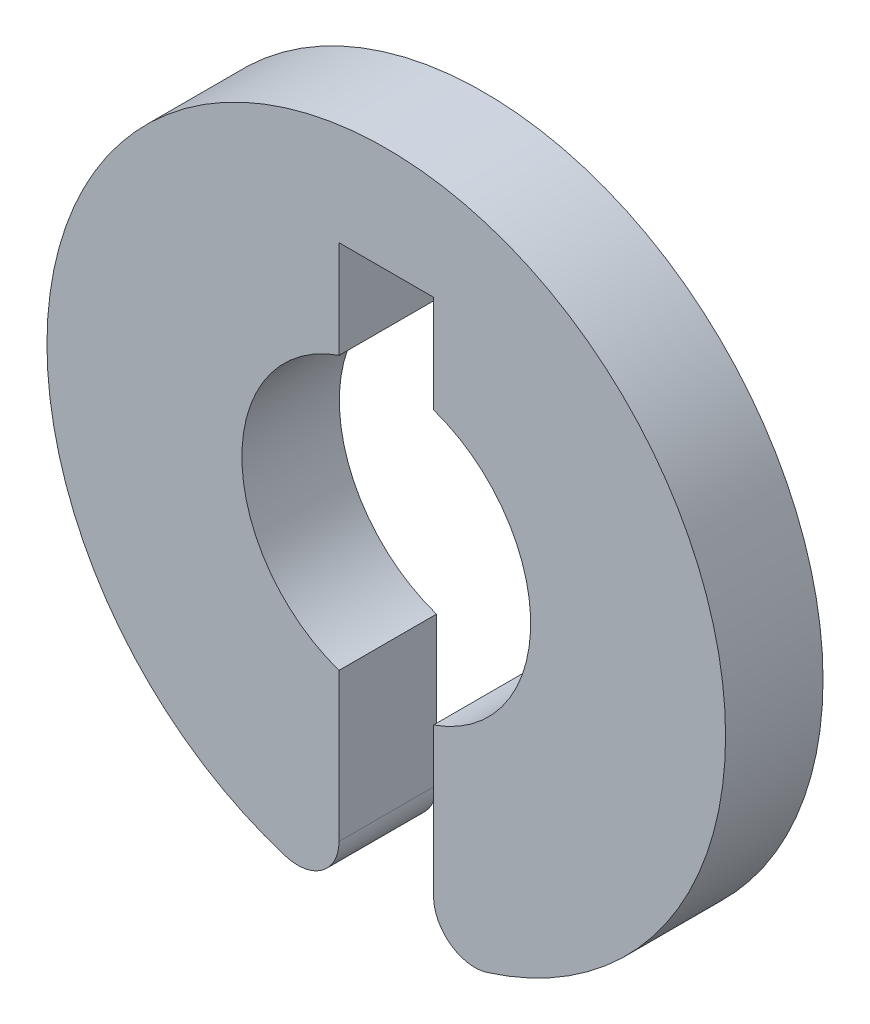
ISO-10303-21;
HEADER;
FILE_DESCRIPTION(('STEP AP214'),'2;1');
FILE_NAME('part.step','',(''),(''),'','','');
FILE_SCHEMA(('AUTOMOTIVE_DESIGN { 1 0 10303 214 1 1 1 1 }'));
ENDSEC;
DATA;
#1=APPLICATION_CONTEXT('core data for automotive mechanical design processes');
#2=APPLICATION_PROTOCOL_DEFINITION('international standard','automotive_design',2000,#1);
#3=PRODUCT_CONTEXT('',#1,'mechanical');
#4=PRODUCT('Part','Part','',(#3));
#5=PRODUCT_RELATED_PRODUCT_CATEGORY('part','',(#4));
#6=PRODUCT_DEFINITION_FORMATION('','',#4);
#7=PRODUCT_DEFINITION_CONTEXT('part definition',#1,'design');
#8=PRODUCT_DEFINITION('design','',#6,#7);
#9=PRODUCT_DEFINITION_SHAPE('','',#8);
#10=(LENGTH_UNIT() NAMED_UNIT(*) SI_UNIT(.MILLI.,.METRE.));
#11=(NAMED_UNIT(*) PLANE_ANGLE_UNIT() SI_UNIT($,.RADIAN.));
#12=(NAMED_UNIT(*) SI_UNIT($,.STERADIAN.) SOLID_ANGLE_UNIT());
#13=UNCERTAINTY_MEASURE_WITH_UNIT(LENGTH_MEASURE(1.E-05),#10,'distance_accuracy_value','');
#14=(GEOMETRIC_REPRESENTATION_CONTEXT(3) GLOBAL_UNCERTAINTY_ASSIGNED_CONTEXT((#13)) GLOBAL_UNIT_ASSIGNED_CONTEXT((#10,
#11,#12)) REPRESENTATION_CONTEXT('',''));
#15=CARTESIAN_POINT('',(0.,0.,0.));
#16=DIRECTION('',(0.,0.,1.));
#17=DIRECTION('',(1.,0.,0.));
#18=AXIS2_PLACEMENT_3D('',#15,#16,#17);
#19=CARTESIAN_POINT('',(0.,0.,3.));
#20=DIRECTION('',(0.,0.,-1.));
#21=DIRECTION('',(-1.,0.,0.));
#22=AXIS2_PLACEMENT_3D('',#19,#20,#21);
#23=CYLINDRICAL_SURFACE('',#22,4.445);
#24=CARTESIAN_POINT('',(0.,0.,0.));
#25=DIRECTION('',(0.,0.,-1.));
#26=DIRECTION('',(1.,0.,0.));
#27=AXIS2_PLACEMENT_3D('',#24,#25,#26);
#28=CIRCLE('',#27,4.445);
#29=CARTESIAN_POINT('',(1.4475,4.20270969137769,0.));
#30=VERTEX_POINT('',#29);
#31=CARTESIAN_POINT('',(1.455,-4.20011904593191,0.));
#32=VERTEX_POINT('',#31);
#33=EDGE_CURVE('E137',#30,#32,#28,.T.);
#34=ORIENTED_EDGE('',*,*,#33,.T.);
#35=DIRECTION('',(0.,0.,-1.));
#36=VECTOR('',#35,1.);
#37=CARTESIAN_POINT('',(1.455,-4.20011904593191,3.));
#38=LINE('',#37,#36);
#39=CARTESIAN_POINT('',(1.455,-4.20011904593191,3.));
#40=VERTEX_POINT('',#39);
#41=EDGE_CURVE('E125',#40,#32,#38,.T.);
#42=ORIENTED_EDGE('',*,*,#41,.F.);
#43=CARTESIAN_POINT('',(0.,0.,3.));
#44=DIRECTION('',(0.,0.,-1.));
#45=DIRECTION('',(1.,0.,0.));
#46=AXIS2_PLACEMENT_3D('',#43,#44,#45);
#47=CIRCLE('',#46,4.445);
#48=CARTESIAN_POINT('',(1.4475,4.20270969137769,3.));
#49=VERTEX_POINT('',#48);
#50=EDGE_CURVE('E130',#49,#40,#47,.T.);
#51=ORIENTED_EDGE('',*,*,#50,.F.);
#52=DIRECTION('',(0.,0.,-1.));
#53=VECTOR('',#52,1.);
#54=CARTESIAN_POINT('',(1.4475,4.20270969137769,3.));
#55=LINE('',#54,#53);
#56=EDGE_CURVE('E183',#49,#30,#55,.T.);
#57=ORIENTED_EDGE('',*,*,#56,.T.);
#58=EDGE_LOOP('',(#34,#42,#51,#57));
#59=FACE_BOUND('',#58,.T.);
#60=ADVANCED_FACE('F45',(#59),#23,.F.);
#61=CARTESIAN_POINT('',(1.455,-10.3431619923503,3.));
#62=DIRECTION('',(1.,0.,0.));
#63=DIRECTION('',(0.,0.,-1.));
#64=AXIS2_PLACEMENT_3D('',#61,#62,#63);
#65=PLANE('',#64);
#66=DIRECTION('',(0.,-1.,0.));
#67=VECTOR('',#66,1.);
#68=CARTESIAN_POINT('',(1.455,-10.3431619923503,0.));
#69=LINE('',#68,#67);
#70=CARTESIAN_POINT('',(1.455,-8.76099309439289,0.));
#71=VERTEX_POINT('',#70);
#72=EDGE_CURVE('E187',#32,#71,#69,.T.);
#73=ORIENTED_EDGE('',*,*,#72,.T.);
#74=DIRECTION('',(0.,0.,-1.));
#75=VECTOR('',#74,1.);
#76=CARTESIAN_POINT('',(1.455,-8.76099309439289,3.));
#77=LINE('',#76,#75);
#78=CARTESIAN_POINT('',(1.455,-8.76099309439289,3.));
#79=VERTEX_POINT('',#78);
#80=EDGE_CURVE('E12',#71,#79,#77,.F.);
#81=ORIENTED_EDGE('',*,*,#80,.T.);
#82=DIRECTION('',(0.,-1.,0.));
#83=VECTOR('',#82,1.);
#84=CARTESIAN_POINT('',(1.455,-10.3431619923503,3.));
#85=LINE('',#84,#83);
#86=EDGE_CURVE('E119',#40,#79,#85,.T.);
#87=ORIENTED_EDGE('',*,*,#86,.F.);
#88=ORIENTED_EDGE('',*,*,#41,.T.);
#89=EDGE_LOOP('',(#73,#81,#87,#88));
#90=FACE_BOUND('',#89,.T.);
#91=ADVANCED_FACE('F120',(#90),#65,.F.);
#92=CARTESIAN_POINT('',(0.,0.,3.));
#93=DIRECTION('',(0.,0.,-1.));
#94=DIRECTION('',(-1.,0.,0.));
#95=AXIS2_PLACEMENT_3D('',#92,#93,#94);
#96=CYLINDRICAL_SURFACE('',#95,10.445);
#97=CARTESIAN_POINT('',(0.,0.,0.));
#98=DIRECTION('',(0.,0.,1.));
#99=DIRECTION('',(-1.,0.,0.));
#100=AXIS2_PLACEMENT_3D('',#97,#98,#99);
#101=CIRCLE('',#100,10.445);
#102=CARTESIAN_POINT('',(3.10219346049046,-9.97368641645055,0.));
#103=VERTEX_POINT('',#102);
#104=CARTESIAN_POINT('',(-3.10219346049046,-9.97368641645055,0.));
#105=VERTEX_POINT('',#104);
#106=EDGE_CURVE('E188',#103,#105,#101,.T.);
#107=ORIENTED_EDGE('',*,*,#106,.T.);
#108=DIRECTION('',(0.,0.,-1.));
#109=VECTOR('',#108,1.);
#110=CARTESIAN_POINT('',(-3.10219346049046,-9.97368641645055,3.));
#111=LINE('',#110,#109);
#112=CARTESIAN_POINT('',(-3.10219346049046,-9.97368641645055,3.));
#113=VERTEX_POINT('',#112);
#114=EDGE_CURVE('E64',#105,#113,#111,.F.);
#115=ORIENTED_EDGE('',*,*,#114,.T.);
#116=CARTESIAN_POINT('',(0.,0.,3.));
#117=DIRECTION('',(0.,0.,1.));
#118=DIRECTION('',(-1.,0.,0.));
#119=AXIS2_PLACEMENT_3D('',#116,#117,#118);
#120=CIRCLE('',#119,10.445);
#121=CARTESIAN_POINT('',(3.10219346049046,-9.97368641645055,3.));
#122=VERTEX_POINT('',#121);
#123=EDGE_CURVE('E127',#122,#113,#120,.T.);
#124=ORIENTED_EDGE('',*,*,#123,.F.);
#125=DIRECTION('',(0.,0.,-1.));
#126=VECTOR('',#125,1.);
#127=CARTESIAN_POINT('',(3.10219346049046,-9.97368641645055,3.));
#128=LINE('',#127,#126);
#129=EDGE_CURVE('E152',#122,#103,#128,.T.);
#130=ORIENTED_EDGE('',*,*,#129,.T.);
#131=EDGE_LOOP('',(#107,#115,#124,#130));
#132=FACE_BOUND('',#131,.T.);
#133=ADVANCED_FACE('F231',(#132),#96,.T.);
#134=CARTESIAN_POINT('',(-1.455,-10.3431619923503,3.));
#135=DIRECTION('',(-1.,0.,0.));
#136=DIRECTION('',(0.,0.,1.));
#137=AXIS2_PLACEMENT_3D('',#134,#135,#136);
#138=PLANE('',#137);
#139=DIRECTION('',(0.,1.,0.));
#140=VECTOR('',#139,1.);
#141=CARTESIAN_POINT('',(-1.455,-10.3431619923503,3.));
#142=LINE('',#141,#140);
#143=CARTESIAN_POINT('',(-1.455,-8.76099309439289,3.));
#144=VERTEX_POINT('',#143);
#145=CARTESIAN_POINT('',(-1.455,-4.20011904593191,3.));
#146=VERTEX_POINT('',#145);
#147=EDGE_CURVE('E169',#144,#146,#142,.T.);
#148=ORIENTED_EDGE('',*,*,#147,.F.);
#149=DIRECTION('',(0.,0.,-1.));
#150=VECTOR('',#149,1.);
#151=CARTESIAN_POINT('',(-1.455,-8.76099309439289,3.));
#152=LINE('',#151,#150);
#153=CARTESIAN_POINT('',(-1.455,-8.76099309439289,0.));
#154=VERTEX_POINT('',#153);
#155=EDGE_CURVE('E139',#144,#154,#152,.T.);
#156=ORIENTED_EDGE('',*,*,#155,.T.);
#157=DIRECTION('',(0.,1.,0.));
#158=VECTOR('',#157,1.);
#159=CARTESIAN_POINT('',(-1.455,-10.3431619923503,0.));
#160=LINE('',#159,#158);
#161=CARTESIAN_POINT('',(-1.455,-4.20011904593191,0.));
#162=VERTEX_POINT('',#161);
#163=EDGE_CURVE('E191',#154,#162,#160,.T.);
#164=ORIENTED_EDGE('',*,*,#163,.T.);
#165=DIRECTION('',(0.,0.,-1.));
#166=VECTOR('',#165,1.);
#167=CARTESIAN_POINT('',(-1.455,-4.20011904593191,3.));
#168=LINE('',#167,#166);
#169=EDGE_CURVE('E143',#146,#162,#168,.T.);
#170=ORIENTED_EDGE('',*,*,#169,.F.);
#171=EDGE_LOOP('',(#148,#156,#164,#170));
#172=FACE_BOUND('',#171,.T.);
#173=ADVANCED_FACE('F240',(#172),#138,.F.);
#174=CARTESIAN_POINT('',(0.,0.,3.));
#175=DIRECTION('',(0.,0.,-1.));
#176=DIRECTION('',(-1.,0.,0.));
#177=AXIS2_PLACEMENT_3D('',#174,#175,#176);
#178=CYLINDRICAL_SURFACE('',#177,4.445);
#179=CARTESIAN_POINT('',(0.,0.,0.));
#180=DIRECTION('',(0.,0.,-1.));
#181=DIRECTION('',(1.,0.,0.));
#182=AXIS2_PLACEMENT_3D('',#179,#180,#181);
#183=CIRCLE('',#182,4.445);
#184=CARTESIAN_POINT('',(-1.4475,4.20270969137769,0.));
#185=VERTEX_POINT('',#184);
#186=EDGE_CURVE('E193',#162,#185,#183,.T.);
#187=ORIENTED_EDGE('',*,*,#186,.T.);
#188=DIRECTION('',(0.,0.,-1.));
#189=VECTOR('',#188,1.);
#190=CARTESIAN_POINT('',(-1.4475,4.20270969137769,3.));
#191=LINE('',#190,#189);
#192=CARTESIAN_POINT('',(-1.4475,4.20270969137769,3.));
#193=VERTEX_POINT('',#192);
#194=EDGE_CURVE('E150',#193,#185,#191,.T.);
#195=ORIENTED_EDGE('',*,*,#194,.F.);
#196=CARTESIAN_POINT('',(0.,0.,3.));
#197=DIRECTION('',(0.,0.,-1.));
#198=DIRECTION('',(1.,0.,0.));
#199=AXIS2_PLACEMENT_3D('',#196,#197,#198);
#200=CIRCLE('',#199,4.445);
#201=EDGE_CURVE('E168',#146,#193,#200,.T.);
#202=ORIENTED_EDGE('',*,*,#201,.F.);
#203=ORIENTED_EDGE('',*,*,#169,.T.);
#204=EDGE_LOOP('',(#187,#195,#202,#203));
#205=FACE_BOUND('',#204,.T.);
#206=ADVANCED_FACE('F239',(#205),#178,.F.);
#207=CARTESIAN_POINT('',(-1.4475,7.20270969137769,3.));
#208=DIRECTION('',(-1.,0.,0.));
#209=DIRECTION('',(0.,-1.,0.));
#210=AXIS2_PLACEMENT_3D('',#207,#208,#209);
#211=PLANE('',#210);
#212=DIRECTION('',(0.,1.,0.));
#213=VECTOR('',#212,1.);
#214=CARTESIAN_POINT('',(-1.4475,7.20270969137769,0.));
#215=LINE('',#214,#213);
#216=CARTESIAN_POINT('',(-1.4475,7.20270969137769,0.));
#217=VERTEX_POINT('',#216);
#218=EDGE_CURVE('E194',#185,#217,#215,.T.);
#219=ORIENTED_EDGE('',*,*,#218,.T.);
#220=DIRECTION('',(0.,0.,-1.));
#221=VECTOR('',#220,1.);
#222=CARTESIAN_POINT('',(-1.4475,7.20270969137769,3.));
#223=LINE('',#222,#221);
#224=CARTESIAN_POINT('',(-1.4475,7.20270969137769,3.));
#225=VERTEX_POINT('',#224);
#226=EDGE_CURVE('E204',#225,#217,#223,.T.);
#227=ORIENTED_EDGE('',*,*,#226,.F.);
#228=DIRECTION('',(0.,1.,0.));
#229=VECTOR('',#228,1.);
#230=CARTESIAN_POINT('',(-1.4475,7.20270969137769,3.));
#231=LINE('',#230,#229);
#232=EDGE_CURVE('E173',#193,#225,#231,.T.);
#233=ORIENTED_EDGE('',*,*,#232,.F.);
#234=ORIENTED_EDGE('',*,*,#194,.T.);
#235=EDGE_LOOP('',(#219,#227,#233,#234));
#236=FACE_BOUND('',#235,.T.);
#237=ADVANCED_FACE('F211',(#236),#211,.F.);
#238=CARTESIAN_POINT('',(-1.4475,7.20270969137769,3.));
#239=DIRECTION('',(0.,1.,0.));
#240=DIRECTION('',(0.,0.,1.));
#241=AXIS2_PLACEMENT_3D('',#238,#239,#240);
#242=PLANE('',#241);
#243=DIRECTION('',(1.,0.,0.));
#244=VECTOR('',#243,1.);
#245=CARTESIAN_POINT('',(-1.4475,7.20270969137769,0.));
#246=LINE('',#245,#244);
#247=CARTESIAN_POINT('',(1.4475,7.20270969137769,0.));
#248=VERTEX_POINT('',#247);
#249=EDGE_CURVE('E197',#217,#248,#246,.T.);
#250=ORIENTED_EDGE('',*,*,#249,.T.);
#251=DIRECTION('',(0.,0.,-1.));
#252=VECTOR('',#251,1.);
#253=CARTESIAN_POINT('',(1.4475,7.20270969137769,3.));
#254=LINE('',#253,#252);
#255=CARTESIAN_POINT('',(1.4475,7.20270969137769,3.));
#256=VERTEX_POINT('',#255);
#257=EDGE_CURVE('E203',#256,#248,#254,.T.);
#258=ORIENTED_EDGE('',*,*,#257,.F.);
#259=DIRECTION('',(1.,0.,0.));
#260=VECTOR('',#259,1.);
#261=CARTESIAN_POINT('',(-1.4475,7.20270969137769,3.));
#262=LINE('',#261,#260);
#263=EDGE_CURVE('E180',#225,#256,#262,.T.);
#264=ORIENTED_EDGE('',*,*,#263,.F.);
#265=ORIENTED_EDGE('',*,*,#226,.T.);
#266=EDGE_LOOP('',(#250,#258,#264,#265));
#267=FACE_BOUND('',#266,.T.);
#268=ADVANCED_FACE('F224',(#267),#242,.F.);
#269=CARTESIAN_POINT('',(1.4475,7.20270969137769,3.));
#270=DIRECTION('',(1.,0.,0.));
#271=DIRECTION('',(0.,1.,0.));
#272=AXIS2_PLACEMENT_3D('',#269,#270,#271);
#273=PLANE('',#272);
#274=DIRECTION('',(0.,-1.,0.));
#275=VECTOR('',#274,1.);
#276=CARTESIAN_POINT('',(1.4475,7.20270969137769,0.));
#277=LINE('',#276,#275);
#278=EDGE_CURVE('E136',#248,#30,#277,.T.);
#279=ORIENTED_EDGE('',*,*,#278,.T.);
#280=ORIENTED_EDGE('',*,*,#56,.F.);
#281=DIRECTION('',(0.,-1.,0.));
#282=VECTOR('',#281,1.);
#283=CARTESIAN_POINT('',(1.4475,7.20270969137769,3.));
#284=LINE('',#283,#282);
#285=EDGE_CURVE('E132',#256,#49,#284,.T.);
#286=ORIENTED_EDGE('',*,*,#285,.F.);
#287=ORIENTED_EDGE('',*,*,#257,.T.);
#288=EDGE_LOOP('',(#279,#280,#286,#287));
#289=FACE_BOUND('',#288,.T.);
#290=ADVANCED_FACE('F226',(#289),#273,.F.);
#291=CARTESIAN_POINT('',(0.,0.,3.));
#292=DIRECTION('',(0.,0.,1.));
#293=DIRECTION('',(1.,0.,0.));
#294=AXIS2_PLACEMENT_3D('',#291,#292,#293);
#295=PLANE('',#294);
#296=ORIENTED_EDGE('',*,*,#123,.T.);
#297=CARTESIAN_POINT('',(-2.725,-8.76099309439289,3.));
#298=DIRECTION('',(0.,0.,1.));
#299=DIRECTION('',(1.,0.,0.));
#300=AXIS2_PLACEMENT_3D('',#297,#298,#299);
#301=CIRCLE('',#300,1.27);
#302=EDGE_CURVE('E49',#113,#144,#301,.T.);
#303=ORIENTED_EDGE('',*,*,#302,.T.);
#304=ORIENTED_EDGE('',*,*,#147,.T.);
#305=ORIENTED_EDGE('',*,*,#201,.T.);
#306=ORIENTED_EDGE('',*,*,#232,.T.);
#307=ORIENTED_EDGE('',*,*,#263,.T.);
#308=ORIENTED_EDGE('',*,*,#285,.T.);
#309=ORIENTED_EDGE('',*,*,#50,.T.);
#310=ORIENTED_EDGE('',*,*,#86,.T.);
#311=CARTESIAN_POINT('',(2.725,-8.76099309439289,3.));
#312=DIRECTION('',(0.,0.,1.));
#313=DIRECTION('',(1.,0.,0.));
#314=AXIS2_PLACEMENT_3D('',#311,#312,#313);
#315=CIRCLE('',#314,1.27);
#316=EDGE_CURVE('E160',#79,#122,#315,.T.);
#317=ORIENTED_EDGE('',*,*,#316,.T.);
#318=EDGE_LOOP('',(#296,#303,#304,#305,#306,#307,#308,#309,#310,#317));
#319=FACE_BOUND('',#318,.T.);
#320=ADVANCED_FACE('F128',(#319),#295,.T.);
#321=CARTESIAN_POINT('',(0.,0.,0.));
#322=DIRECTION('',(0.,0.,1.));
#323=DIRECTION('',(1.,0.,0.));
#324=AXIS2_PLACEMENT_3D('',#321,#322,#323);
#325=PLANE('',#324);
#326=ORIENTED_EDGE('',*,*,#163,.F.);
#327=CARTESIAN_POINT('',(-2.725,-8.76099309439289,0.));
#328=DIRECTION('',(0.,0.,1.));
#329=DIRECTION('',(1.,0.,0.));
#330=AXIS2_PLACEMENT_3D('',#327,#328,#329);
#331=CIRCLE('',#330,1.27);
#332=EDGE_CURVE('E155',#154,#105,#331,.F.);
#333=ORIENTED_EDGE('',*,*,#332,.T.);
#334=ORIENTED_EDGE('',*,*,#106,.F.);
#335=CARTESIAN_POINT('',(2.725,-8.76099309439289,0.));
#336=DIRECTION('',(0.,0.,1.));
#337=DIRECTION('',(1.,0.,0.));
#338=AXIS2_PLACEMENT_3D('',#335,#336,#337);
#339=CIRCLE('',#338,1.27);
#340=EDGE_CURVE('E145',#103,#71,#339,.F.);
#341=ORIENTED_EDGE('',*,*,#340,.T.);
#342=ORIENTED_EDGE('',*,*,#72,.F.);
#343=ORIENTED_EDGE('',*,*,#33,.F.);
#344=ORIENTED_EDGE('',*,*,#278,.F.);
#345=ORIENTED_EDGE('',*,*,#249,.F.);
#346=ORIENTED_EDGE('',*,*,#218,.F.);
#347=ORIENTED_EDGE('',*,*,#186,.F.);
#348=EDGE_LOOP('',(#326,#333,#334,#341,#342,#343,#344,#345,#346,#347));
#349=FACE_BOUND('',#348,.T.);
#350=ADVANCED_FACE('F218',(#349),#325,.F.);
#351=CARTESIAN_POINT('',(-2.725,-8.76099309439289,3.));
#352=DIRECTION('',(0.,0.,-1.));
#353=DIRECTION('',(-1.,0.,0.));
#354=AXIS2_PLACEMENT_3D('',#351,#352,#353);
#355=CYLINDRICAL_SURFACE('',#354,1.27);
#356=ORIENTED_EDGE('',*,*,#302,.F.);
#357=ORIENTED_EDGE('',*,*,#114,.F.);
#358=ORIENTED_EDGE('',*,*,#332,.F.);
#359=ORIENTED_EDGE('',*,*,#155,.F.);
#360=EDGE_LOOP('',(#356,#357,#358,#359));
#361=FACE_BOUND('',#360,.T.);
#362=ADVANCED_FACE('F232',(#361),#355,.T.);
#363=CARTESIAN_POINT('',(2.725,-8.76099309439289,3.));
#364=DIRECTION('',(0.,0.,-1.));
#365=DIRECTION('',(-1.,0.,0.));
#366=AXIS2_PLACEMENT_3D('',#363,#364,#365);
#367=CYLINDRICAL_SURFACE('',#366,1.27);
#368=ORIENTED_EDGE('',*,*,#316,.F.);
#369=ORIENTED_EDGE('',*,*,#80,.F.);
#370=ORIENTED_EDGE('',*,*,#340,.F.);
#371=ORIENTED_EDGE('',*,*,#129,.F.);
#372=EDGE_LOOP('',(#368,#369,#370,#371));
#373=FACE_BOUND('',#372,.T.);
#374=ADVANCED_FACE('F42',(#373),#367,.T.);
#375=CLOSED_SHELL('',(#60,#91,#133,#173,#206,#237,#268,#290,#320,#350,#362,#374));
#376=MANIFOLD_SOLID_BREP('B2',#375);
#377=ADVANCED_BREP_SHAPE_REPRESENTATION('',(#18,#376),#14);
#378=SHAPE_DEFINITION_REPRESENTATION(#9,#377);
ENDSEC;
END-ISO-10303-21;
